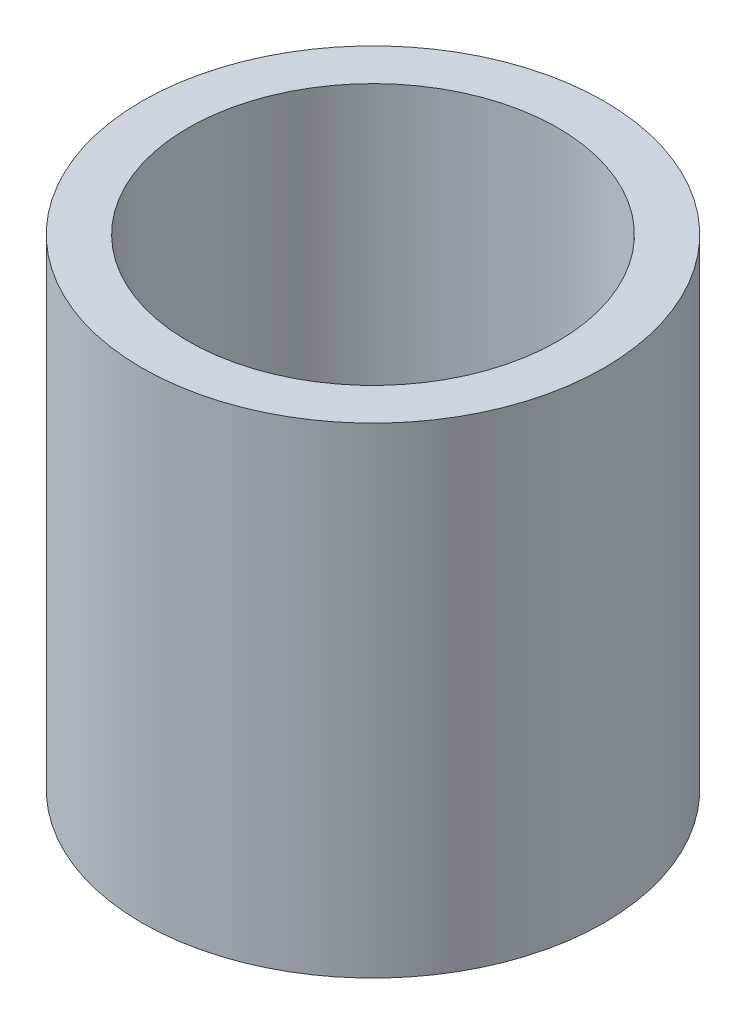
ISO-10303-21;
HEADER;
FILE_DESCRIPTION(('STEP AP214'),'2;1');
FILE_NAME('part.step','',(''),(''),'','','');
FILE_SCHEMA(('AUTOMOTIVE_DESIGN { 1 0 10303 214 1 1 1 1 }'));
ENDSEC;
DATA;
#1=APPLICATION_CONTEXT('core data for automotive mechanical design processes');
#2=APPLICATION_PROTOCOL_DEFINITION('international standard','automotive_design',2000,#1);
#3=PRODUCT_CONTEXT('',#1,'mechanical');
#4=PRODUCT('Part','Part','',(#3));
#5=PRODUCT_RELATED_PRODUCT_CATEGORY('part','',(#4));
#6=PRODUCT_DEFINITION_FORMATION('','',#4);
#7=PRODUCT_DEFINITION_CONTEXT('part definition',#1,'design');
#8=PRODUCT_DEFINITION('design','',#6,#7);
#9=PRODUCT_DEFINITION_SHAPE('','',#8);
#10=(LENGTH_UNIT() NAMED_UNIT(*) SI_UNIT(.MILLI.,.METRE.));
#11=(NAMED_UNIT(*) PLANE_ANGLE_UNIT() SI_UNIT($,.RADIAN.));
#12=(NAMED_UNIT(*) SI_UNIT($,.STERADIAN.) SOLID_ANGLE_UNIT());
#13=UNCERTAINTY_MEASURE_WITH_UNIT(LENGTH_MEASURE(1.E-05),#10,'distance_accuracy_value','');
#14=(GEOMETRIC_REPRESENTATION_CONTEXT(3) GLOBAL_UNCERTAINTY_ASSIGNED_CONTEXT((#13)) GLOBAL_UNIT_ASSIGNED_CONTEXT((#10,
#11,#12)) REPRESENTATION_CONTEXT('',''));
#15=CARTESIAN_POINT('',(0.,0.,0.));
#16=DIRECTION('',(0.,0.,1.));
#17=DIRECTION('',(1.,0.,0.));
#18=AXIS2_PLACEMENT_3D('',#15,#16,#17);
#19=CARTESIAN_POINT('',(3.82034848200874E-09,5.51999513891852,11.25));
#20=DIRECTION('',(0.,1.,0.));
#21=DIRECTION('',(1.,0.,0.));
#22=AXIS2_PLACEMENT_3D('',#19,#20,#21);
#23=PLANE('',#22);
#24=CARTESIAN_POINT('',(5.72148296859243,5.51999513891849,8.49999837338022));
#25=DIRECTION('',(0.,-1.,0.));
#26=DIRECTION('',(1.,0.,0.));
#27=AXIS2_PLACEMENT_3D('',#24,#25,#26);
#28=CIRCLE('',#27,0.4);
#29=CARTESIAN_POINT('',(6.12148296859243,5.51999513891849,8.49999837338022));
#30=VERTEX_POINT('',#29);
#31=EDGE_CURVE('E18',#30,#30,#28,.T.);
#32=ORIENTED_EDGE('',*,*,#31,.T.);
#33=EDGE_LOOP('',(#32));
#34=FACE_BOUND('',#33,.T.);
#35=CARTESIAN_POINT('',(5.72148296859243,5.51999513891849,8.49999837338022));
#36=DIRECTION('',(0.,1.,0.));
#37=DIRECTION('',(1.,0.,0.));
#38=AXIS2_PLACEMENT_3D('',#35,#36,#37);
#39=CIRCLE('',#38,0.5);
#40=CARTESIAN_POINT('',(6.22148296859243,5.51999513891849,8.49999837338022));
#41=VERTEX_POINT('',#40);
#42=EDGE_CURVE('E10',#41,#41,#39,.T.);
#43=ORIENTED_EDGE('',*,*,#42,.T.);
#44=EDGE_LOOP('',(#43));
#45=FACE_BOUND('',#44,.T.);
#46=ADVANCED_FACE('F15',(#34,#45),#23,.T.);
#47=CARTESIAN_POINT('',(5.72148296859243,5.4999951389185,8.49999837338022));
#48=DIRECTION('',(0.,1.,0.));
#49=DIRECTION('',(1.,0.,0.));
#50=AXIS2_PLACEMENT_3D('',#47,#48,#49);
#51=CYLINDRICAL_SURFACE('',#50,0.5);
#52=CARTESIAN_POINT('',(5.72148296859243,4.47999513891849,8.49999837338022));
#53=DIRECTION('',(0.,-1.,0.));
#54=DIRECTION('',(1.,0.,0.));
#55=AXIS2_PLACEMENT_3D('',#52,#53,#54);
#56=CIRCLE('',#55,0.5);
#57=CARTESIAN_POINT('',(6.22148296859243,4.47999513891849,8.49999837338022));
#58=VERTEX_POINT('',#57);
#59=EDGE_CURVE('E34',#58,#58,#56,.T.);
#60=ORIENTED_EDGE('',*,*,#59,.F.);
#61=EDGE_LOOP('',(#60));
#62=FACE_BOUND('',#61,.T.);
#63=ORIENTED_EDGE('',*,*,#42,.F.);
#64=EDGE_LOOP('',(#63));
#65=FACE_BOUND('',#64,.T.);
#66=ADVANCED_FACE('F49',(#62,#65),#51,.T.);
#67=CARTESIAN_POINT('',(5.72148296859243,5.4999951389185,8.49999837338022));
#68=DIRECTION('',(0.,1.,0.));
#69=DIRECTION('',(1.,0.,0.));
#70=AXIS2_PLACEMENT_3D('',#67,#68,#69);
#71=CYLINDRICAL_SURFACE('',#70,0.4);
#72=CARTESIAN_POINT('',(5.72148296859243,4.47999513891849,8.49999837338022));
#73=DIRECTION('',(0.,1.,0.));
#74=DIRECTION('',(1.,0.,0.));
#75=AXIS2_PLACEMENT_3D('',#72,#73,#74);
#76=CIRCLE('',#75,0.4);
#77=CARTESIAN_POINT('',(6.12148296859243,4.47999513891849,8.49999837338022));
#78=VERTEX_POINT('',#77);
#79=EDGE_CURVE('E32',#78,#78,#76,.T.);
#80=ORIENTED_EDGE('',*,*,#79,.F.);
#81=EDGE_LOOP('',(#80));
#82=FACE_BOUND('',#81,.T.);
#83=ORIENTED_EDGE('',*,*,#31,.F.);
#84=EDGE_LOOP('',(#83));
#85=FACE_BOUND('',#84,.T.);
#86=ADVANCED_FACE('F52',(#82,#85),#71,.F.);
#87=CARTESIAN_POINT('',(3.82033960022454E-09,4.47999513891852,11.25));
#88=DIRECTION('',(0.,1.,0.));
#89=DIRECTION('',(1.,0.,0.));
#90=AXIS2_PLACEMENT_3D('',#87,#88,#89);
#91=PLANE('',#90);
#92=ORIENTED_EDGE('',*,*,#79,.T.);
#93=EDGE_LOOP('',(#92));
#94=FACE_BOUND('',#93,.T.);
#95=ORIENTED_EDGE('',*,*,#59,.T.);
#96=EDGE_LOOP('',(#95));
#97=FACE_BOUND('',#96,.T.);
#98=ADVANCED_FACE('F47',(#94,#97),#91,.F.);
#99=CLOSED_SHELL('',(#46,#66,#86,#98));
#100=MANIFOLD_SOLID_BREP('B1',#99);
#101=ADVANCED_BREP_SHAPE_REPRESENTATION('',(#18,#100),#14);
#102=SHAPE_DEFINITION_REPRESENTATION(#9,#101);
ENDSEC;
END-ISO-10303-21;
